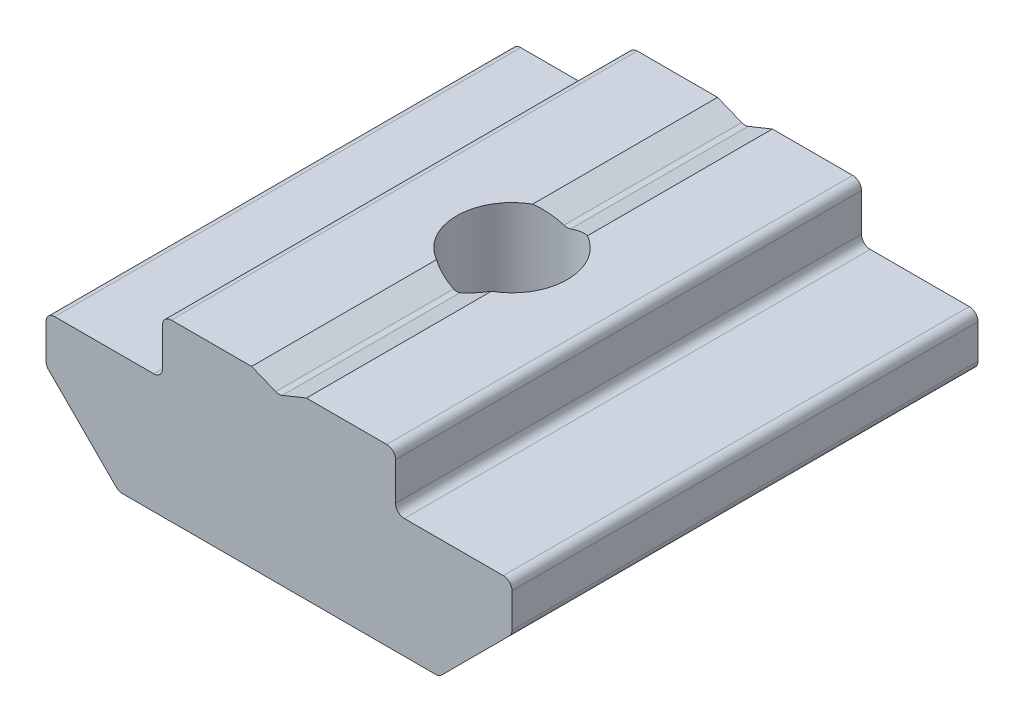
ISO-10303-21;
HEADER;
FILE_DESCRIPTION(('STEP AP214'),'2;1');
FILE_NAME('part.step','',(''),(''),'','','');
FILE_SCHEMA(('AUTOMOTIVE_DESIGN { 1 0 10303 214 1 1 1 1 }'));
ENDSEC;
DATA;
#1=APPLICATION_CONTEXT('core data for automotive mechanical design processes');
#2=APPLICATION_PROTOCOL_DEFINITION('international standard','automotive_design',2000,#1);
#3=PRODUCT_CONTEXT('',#1,'mechanical');
#4=PRODUCT('Part','Part','',(#3));
#5=PRODUCT_RELATED_PRODUCT_CATEGORY('part','',(#4));
#6=PRODUCT_DEFINITION_FORMATION('','',#4);
#7=PRODUCT_DEFINITION_CONTEXT('part definition',#1,'design');
#8=PRODUCT_DEFINITION('design','',#6,#7);
#9=PRODUCT_DEFINITION_SHAPE('','',#8);
#10=(LENGTH_UNIT() NAMED_UNIT(*) SI_UNIT(.MILLI.,.METRE.));
#11=(NAMED_UNIT(*) PLANE_ANGLE_UNIT() SI_UNIT($,.RADIAN.));
#12=(NAMED_UNIT(*) SI_UNIT($,.STERADIAN.) SOLID_ANGLE_UNIT());
#13=UNCERTAINTY_MEASURE_WITH_UNIT(LENGTH_MEASURE(1.E-05),#10,'distance_accuracy_value','');
#14=(GEOMETRIC_REPRESENTATION_CONTEXT(3) GLOBAL_UNCERTAINTY_ASSIGNED_CONTEXT((#13)) GLOBAL_UNIT_ASSIGNED_CONTEXT((#10,
#11,#12)) REPRESENTATION_CONTEXT('',''));
#15=CARTESIAN_POINT('',(0.,0.,0.));
#16=DIRECTION('',(0.,0.,1.));
#17=DIRECTION('',(1.,0.,0.));
#18=AXIS2_PLACEMENT_3D('',#15,#16,#17);
#19=CARTESIAN_POINT('',(0.940533004298188,6.,8.));
#20=DIRECTION('',(0.374606593415912,-0.927183854566787,0.));
#21=DIRECTION('',(0.927183854566787,0.374606593415912,0.));
#22=AXIS2_PLACEMENT_3D('',#19,#20,#21);
#23=PLANE('',#22);
#24=CARTESIAN_POINT('',(0.,5.62,0.));
#25=DIRECTION('',(0.374606593415912,-0.927183854566787,0.));
#26=DIRECTION('',(-0.927183854566787,-0.374606593415912,0.));
#27=AXIS2_PLACEMENT_3D('',#24,#25,#26);
#28=ELLIPSE('',#27,2.04921601108741,1.9);
#29=CARTESIAN_POINT('',(0.112381978024775,5.66540526643324,1.89667348033741));
#30=VERTEX_POINT('',#29);
#31=CARTESIAN_POINT('',(0.940533004298192,6.,1.65087784763919));
#32=VERTEX_POINT('',#31);
#33=EDGE_CURVE('E223',#30,#32,#28,.F.);
#34=ORIENTED_EDGE('',*,*,#33,.F.);
#35=DIRECTION('',(0.,0.,-1.));
#36=VECTOR('',#35,1.);
#37=CARTESIAN_POINT('',(0.112381978024774,5.66540526643324,8.));
#38=LINE('',#37,#36);
#39=CARTESIAN_POINT('',(0.112381978024774,5.66540526643324,8.));
#40=VERTEX_POINT('',#39);
#41=EDGE_CURVE('E268',#30,#40,#38,.F.);
#42=ORIENTED_EDGE('',*,*,#41,.T.);
#43=DIRECTION('',(-0.927183854566787,-0.374606593415912,0.));
#44=VECTOR('',#43,1.);
#45=CARTESIAN_POINT('',(0.940533004298188,6.,8.));
#46=LINE('',#45,#44);
#47=CARTESIAN_POINT('',(0.940533004298188,6.,8.));
#48=VERTEX_POINT('',#47);
#49=EDGE_CURVE('E254',#48,#40,#46,.T.);
#50=ORIENTED_EDGE('',*,*,#49,.F.);
#51=DIRECTION('',(0.,0.,-1.));
#52=VECTOR('',#51,1.);
#53=CARTESIAN_POINT('',(0.940533004298188,6.,8.));
#54=LINE('',#53,#52);
#55=EDGE_CURVE('E245',#48,#32,#54,.T.);
#56=ORIENTED_EDGE('',*,*,#55,.T.);
#57=EDGE_LOOP('',(#34,#42,#50,#56));
#58=FACE_BOUND('',#57,.T.);
#59=ADVANCED_FACE('F37',(#58),#23,.F.);
#60=DIRECTION('',(-0.927183854566787,-0.374606593415912,0.));
#61=VECTOR('',#60,1.);
#62=CARTESIAN_POINT('',(0.940533004298188,6.,-8.));
#63=LINE('',#62,#61);
#64=CARTESIAN_POINT('',(0.940533004298188,6.,-8.));
#65=VERTEX_POINT('',#64);
#66=CARTESIAN_POINT('',(0.112381978024774,5.66540526643324,-8.));
#67=VERTEX_POINT('',#66);
#68=EDGE_CURVE('E584',#65,#67,#63,.T.);
#69=ORIENTED_EDGE('',*,*,#68,.T.);
#70=DIRECTION('',(0.,0.,-1.));
#71=VECTOR('',#70,1.);
#72=CARTESIAN_POINT('',(0.112381978024774,5.66540526643324,-1.9));
#73=LINE('',#72,#71);
#74=CARTESIAN_POINT('',(0.112381978024774,5.66540526643324,-1.89667348033741));
#75=VERTEX_POINT('',#74);
#76=EDGE_CURVE('E261',#67,#75,#73,.F.);
#77=ORIENTED_EDGE('',*,*,#76,.T.);
#78=CARTESIAN_POINT('',(0.940533004298192,6.,-1.65087784763919));
#79=VERTEX_POINT('',#78);
#80=EDGE_CURVE('E238',#79,#75,#28,.F.);
#81=ORIENTED_EDGE('',*,*,#80,.F.);
#82=EDGE_CURVE('E246',#79,#65,#54,.T.);
#83=ORIENTED_EDGE('',*,*,#82,.T.);
#84=EDGE_LOOP('',(#69,#77,#81,#83));
#85=FACE_BOUND('',#84,.T.);
#86=ADVANCED_FACE('F392',(#85),#23,.F.);
#87=CARTESIAN_POINT('',(0.,5.62,8.));
#88=DIRECTION('',(-0.374606593415913,-0.927183854566787,0.));
#89=DIRECTION('',(0.927183854566787,-0.374606593415913,0.));
#90=AXIS2_PLACEMENT_3D('',#87,#88,#89);
#91=PLANE('',#90);
#92=CARTESIAN_POINT('',(0.,5.62,0.));
#93=DIRECTION('',(-0.374606593415913,-0.927183854566787,0.));
#94=DIRECTION('',(0.927183854566787,-0.374606593415913,0.));
#95=AXIS2_PLACEMENT_3D('',#92,#93,#94);
#96=ELLIPSE('',#95,2.04921601108741,1.9);
#97=CARTESIAN_POINT('',(-0.112381978024775,5.66540526643324,-1.89667348033741));
#98=VERTEX_POINT('',#97);
#99=CARTESIAN_POINT('',(-0.940533004298189,6.,-1.6508778476392));
#100=VERTEX_POINT('',#99);
#101=EDGE_CURVE('E239',#98,#100,#96,.F.);
#102=ORIENTED_EDGE('',*,*,#101,.F.);
#103=DIRECTION('',(0.,0.,-1.));
#104=VECTOR('',#103,1.);
#105=CARTESIAN_POINT('',(-0.112381978024774,5.66540526643324,-8.));
#106=LINE('',#105,#104);
#107=CARTESIAN_POINT('',(-0.112381978024774,5.66540526643324,-8.));
#108=VERTEX_POINT('',#107);
#109=EDGE_CURVE('E251',#98,#108,#106,.T.);
#110=ORIENTED_EDGE('',*,*,#109,.T.);
#111=DIRECTION('',(-0.927183854566787,0.374606593415913,0.));
#112=VECTOR('',#111,1.);
#113=CARTESIAN_POINT('',(0.,5.62,-8.));
#114=LINE('',#113,#112);
#115=CARTESIAN_POINT('',(-0.940533004298189,6.,-8.));
#116=VERTEX_POINT('',#115);
#117=EDGE_CURVE('E548',#108,#116,#114,.T.);
#118=ORIENTED_EDGE('',*,*,#117,.T.);
#119=DIRECTION('',(0.,0.,-1.));
#120=VECTOR('',#119,1.);
#121=CARTESIAN_POINT('',(-0.940533004298189,6.,8.));
#122=LINE('',#121,#120);
#123=EDGE_CURVE('E533',#100,#116,#122,.T.);
#124=ORIENTED_EDGE('',*,*,#123,.F.);
#125=EDGE_LOOP('',(#102,#110,#118,#124));
#126=FACE_BOUND('',#125,.T.);
#127=ADVANCED_FACE('F390',(#126),#91,.F.);
#128=DIRECTION('',(-0.927183854566787,0.374606593415913,0.));
#129=VECTOR('',#128,1.);
#130=CARTESIAN_POINT('',(0.,5.62,8.));
#131=LINE('',#130,#129);
#132=CARTESIAN_POINT('',(-0.112381978024774,5.66540526643324,8.));
#133=VERTEX_POINT('',#132);
#134=CARTESIAN_POINT('',(-0.940533004298189,6.,8.));
#135=VERTEX_POINT('',#134);
#136=EDGE_CURVE('E454',#133,#135,#131,.T.);
#137=ORIENTED_EDGE('',*,*,#136,.F.);
#138=DIRECTION('',(0.,0.,-1.));
#139=VECTOR('',#138,1.);
#140=CARTESIAN_POINT('',(-0.112381978024774,5.66540526643324,1.9));
#141=LINE('',#140,#139);
#142=CARTESIAN_POINT('',(-0.112381978024774,5.66540526643324,1.89667348033741));
#143=VERTEX_POINT('',#142);
#144=EDGE_CURVE('E262',#133,#143,#141,.T.);
#145=ORIENTED_EDGE('',*,*,#144,.T.);
#146=CARTESIAN_POINT('',(-0.940533004298189,6.,1.6508778476392));
#147=VERTEX_POINT('',#146);
#148=EDGE_CURVE('E236',#147,#143,#96,.F.);
#149=ORIENTED_EDGE('',*,*,#148,.F.);
#150=EDGE_CURVE('E257',#135,#147,#122,.T.);
#151=ORIENTED_EDGE('',*,*,#150,.F.);
#152=EDGE_LOOP('',(#137,#145,#149,#151));
#153=FACE_BOUND('',#152,.T.);
#154=ADVANCED_FACE('F391',(#153),#91,.F.);
#155=CARTESIAN_POINT('',(-4.,4.1,8.));
#156=DIRECTION('',(0.,-1.,0.));
#157=DIRECTION('',(0.,0.,-1.));
#158=AXIS2_PLACEMENT_3D('',#155,#156,#157);
#159=PLANE('',#158);
#160=DIRECTION('',(-1.,0.,0.));
#161=VECTOR('',#160,1.);
#162=CARTESIAN_POINT('',(-4.,4.1,8.));
#163=LINE('',#162,#161);
#164=CARTESIAN_POINT('',(-4.3,4.1,8.));
#165=VERTEX_POINT('',#164);
#166=CARTESIAN_POINT('',(-7.7,4.1,8.));
#167=VERTEX_POINT('',#166);
#168=EDGE_CURVE('E431',#165,#167,#163,.T.);
#169=ORIENTED_EDGE('',*,*,#168,.F.);
#170=DIRECTION('',(0.,0.,-1.));
#171=VECTOR('',#170,1.);
#172=CARTESIAN_POINT('',(-4.3,4.1,-8.));
#173=LINE('',#172,#171);
#174=CARTESIAN_POINT('',(-4.3,4.1,-8.));
#175=VERTEX_POINT('',#174);
#176=EDGE_CURVE('E325',#165,#175,#173,.T.);
#177=ORIENTED_EDGE('',*,*,#176,.T.);
#178=DIRECTION('',(-1.,0.,0.));
#179=VECTOR('',#178,1.);
#180=CARTESIAN_POINT('',(-4.,4.1,-8.));
#181=LINE('',#180,#179);
#182=CARTESIAN_POINT('',(-7.7,4.1,-8.));
#183=VERTEX_POINT('',#182);
#184=EDGE_CURVE('E591',#175,#183,#181,.T.);
#185=ORIENTED_EDGE('',*,*,#184,.T.);
#186=DIRECTION('',(0.,0.,-1.));
#187=VECTOR('',#186,1.);
#188=CARTESIAN_POINT('',(-7.7,4.1,8.));
#189=LINE('',#188,#187);
#190=EDGE_CURVE('E320',#183,#167,#189,.F.);
#191=ORIENTED_EDGE('',*,*,#190,.T.);
#192=EDGE_LOOP('',(#169,#177,#185,#191));
#193=FACE_BOUND('',#192,.T.);
#194=ADVANCED_FACE('F422',(#193),#159,.F.);
#195=CARTESIAN_POINT('',(-8.,4.1,8.));
#196=DIRECTION('',(1.,0.,0.));
#197=DIRECTION('',(0.,0.,-1.));
#198=AXIS2_PLACEMENT_3D('',#195,#196,#197);
#199=PLANE('',#198);
#200=DIRECTION('',(0.,-1.,0.));
#201=VECTOR('',#200,1.);
#202=CARTESIAN_POINT('',(-8.,4.1,8.));
#203=LINE('',#202,#201);
#204=CARTESIAN_POINT('',(-8.,3.8,8.));
#205=VERTEX_POINT('',#204);
#206=CARTESIAN_POINT('',(-8.,2.62426406871193,8.));
#207=VERTEX_POINT('',#206);
#208=EDGE_CURVE('E437',#205,#207,#203,.T.);
#209=ORIENTED_EDGE('',*,*,#208,.F.);
#210=DIRECTION('',(0.,0.,-1.));
#211=VECTOR('',#210,1.);
#212=CARTESIAN_POINT('',(-8.,3.8,8.));
#213=LINE('',#212,#211);
#214=CARTESIAN_POINT('',(-8.,3.8,-8.));
#215=VERTEX_POINT('',#214);
#216=EDGE_CURVE('E329',#205,#215,#213,.T.);
#217=ORIENTED_EDGE('',*,*,#216,.T.);
#218=DIRECTION('',(0.,-1.,0.));
#219=VECTOR('',#218,1.);
#220=CARTESIAN_POINT('',(-8.,4.1,-8.));
#221=LINE('',#220,#219);
#222=CARTESIAN_POINT('',(-8.,2.62426406871193,-8.));
#223=VERTEX_POINT('',#222);
#224=EDGE_CURVE('E600',#215,#223,#221,.T.);
#225=ORIENTED_EDGE('',*,*,#224,.T.);
#226=DIRECTION('',(0.,0.,-1.));
#227=VECTOR('',#226,1.);
#228=CARTESIAN_POINT('',(-8.,2.62426406871193,8.));
#229=LINE('',#228,#227);
#230=EDGE_CURVE('E322',#223,#207,#229,.F.);
#231=ORIENTED_EDGE('',*,*,#230,.T.);
#232=EDGE_LOOP('',(#209,#217,#225,#231));
#233=FACE_BOUND('',#232,.T.);
#234=ADVANCED_FACE('F421',(#233),#199,.F.);
#235=CARTESIAN_POINT('',(-8.,2.5,8.));
#236=DIRECTION('',(0.707106781186549,0.707106781186546,0.));
#237=DIRECTION('',(-0.707106781186546,0.707106781186549,0.));
#238=AXIS2_PLACEMENT_3D('',#235,#236,#237);
#239=PLANE('',#238);
#240=DIRECTION('',(0.707106781186546,-0.707106781186549,0.));
#241=VECTOR('',#240,1.);
#242=CARTESIAN_POINT('',(-8.,2.5,8.));
#243=LINE('',#242,#241);
#244=CARTESIAN_POINT('',(-7.91213203435596,2.41213203435596,8.));
#245=VERTEX_POINT('',#244);
#246=CARTESIAN_POINT('',(-5.58786796564405,0.0878679656440362,8.));
#247=VERTEX_POINT('',#246);
#248=EDGE_CURVE('E554',#245,#247,#243,.T.);
#249=ORIENTED_EDGE('',*,*,#248,.F.);
#250=DIRECTION('',(0.,0.,-1.));
#251=VECTOR('',#250,1.);
#252=CARTESIAN_POINT('',(-7.91213203435596,2.41213203435596,8.));
#253=LINE('',#252,#251);
#254=CARTESIAN_POINT('',(-7.91213203435596,2.41213203435596,-8.));
#255=VERTEX_POINT('',#254);
#256=EDGE_CURVE('E332',#245,#255,#253,.T.);
#257=ORIENTED_EDGE('',*,*,#256,.T.);
#258=DIRECTION('',(0.707106781186546,-0.707106781186549,0.));
#259=VECTOR('',#258,1.);
#260=CARTESIAN_POINT('',(-8.,2.5,-8.));
#261=LINE('',#260,#259);
#262=CARTESIAN_POINT('',(-5.58786796564405,0.0878679656440362,-8.));
#263=VERTEX_POINT('',#262);
#264=EDGE_CURVE('E575',#255,#263,#261,.T.);
#265=ORIENTED_EDGE('',*,*,#264,.T.);
#266=DIRECTION('',(0.,0.,-1.));
#267=VECTOR('',#266,1.);
#268=CARTESIAN_POINT('',(-5.58786796564405,0.0878679656440362,8.));
#269=LINE('',#268,#267);
#270=EDGE_CURVE('E326',#263,#247,#269,.F.);
#271=ORIENTED_EDGE('',*,*,#270,.T.);
#272=EDGE_LOOP('',(#249,#257,#265,#271));
#273=FACE_BOUND('',#272,.T.);
#274=ADVANCED_FACE('F420',(#273),#239,.F.);
#275=CARTESIAN_POINT('',(-5.50000000000001,0.,8.));
#276=DIRECTION('',(0.,1.,0.));
#277=DIRECTION('',(-1.,0.,0.));
#278=AXIS2_PLACEMENT_3D('',#275,#276,#277);
#279=PLANE('',#278);
#280=CARTESIAN_POINT('',(0.,0.,0.));
#281=DIRECTION('',(0.,1.,0.));
#282=DIRECTION('',(0.,0.,1.));
#283=AXIS2_PLACEMENT_3D('',#280,#281,#282);
#284=CIRCLE('',#283,1.9);
#285=CARTESIAN_POINT('',(0.,0.,1.9));
#286=VERTEX_POINT('',#285);
#287=EDGE_CURVE('E249',#286,#286,#284,.T.);
#288=ORIENTED_EDGE('',*,*,#287,.T.);
#289=EDGE_LOOP('',(#288));
#290=FACE_BOUND('',#289,.T.);
#291=DIRECTION('',(1.,0.,0.));
#292=VECTOR('',#291,1.);
#293=CARTESIAN_POINT('',(-5.50000000000001,0.,8.));
#294=LINE('',#293,#292);
#295=CARTESIAN_POINT('',(-5.37573593128808,0.,8.));
#296=VERTEX_POINT('',#295);
#297=CARTESIAN_POINT('',(5.37573593128808,0.,8.));
#298=VERTEX_POINT('',#297);
#299=EDGE_CURVE('E526',#296,#298,#294,.T.);
#300=ORIENTED_EDGE('',*,*,#299,.F.);
#301=DIRECTION('',(0.,0.,-1.));
#302=VECTOR('',#301,1.);
#303=CARTESIAN_POINT('',(-5.37573593128808,0.,8.));
#304=LINE('',#303,#302);
#305=CARTESIAN_POINT('',(-5.37573593128808,0.,-8.));
#306=VERTEX_POINT('',#305);
#307=EDGE_CURVE('E340',#296,#306,#304,.T.);
#308=ORIENTED_EDGE('',*,*,#307,.T.);
#309=DIRECTION('',(1.,0.,0.));
#310=VECTOR('',#309,1.);
#311=CARTESIAN_POINT('',(-5.50000000000001,0.,-8.));
#312=LINE('',#311,#310);
#313=CARTESIAN_POINT('',(5.37573593128808,0.,-8.));
#314=VERTEX_POINT('',#313);
#315=EDGE_CURVE('E568',#306,#314,#312,.T.);
#316=ORIENTED_EDGE('',*,*,#315,.T.);
#317=DIRECTION('',(0.,0.,-1.));
#318=VECTOR('',#317,1.);
#319=CARTESIAN_POINT('',(5.37573593128808,0.,8.));
#320=LINE('',#319,#318);
#321=EDGE_CURVE('E334',#314,#298,#320,.F.);
#322=ORIENTED_EDGE('',*,*,#321,.T.);
#323=EDGE_LOOP('',(#300,#308,#316,#322));
#324=FACE_BOUND('',#323,.T.);
#325=ADVANCED_FACE('F411',(#290,#324),#279,.F.);
#326=CARTESIAN_POINT('',(8.,2.49999999999998,8.));
#327=DIRECTION('',(-0.707106781186546,0.707106781186549,0.));
#328=DIRECTION('',(-0.707106781186549,-0.707106781186546,0.));
#329=AXIS2_PLACEMENT_3D('',#326,#327,#328);
#330=PLANE('',#329);
#331=DIRECTION('',(0.707106781186549,0.707106781186546,0.));
#332=VECTOR('',#331,1.);
#333=CARTESIAN_POINT('',(8.,2.49999999999998,8.));
#334=LINE('',#333,#332);
#335=CARTESIAN_POINT('',(5.58786796564405,0.0878679656440362,8.));
#336=VERTEX_POINT('',#335);
#337=CARTESIAN_POINT('',(7.91213203435596,2.41213203435594,8.));
#338=VERTEX_POINT('',#337);
#339=EDGE_CURVE('E520',#336,#338,#334,.T.);
#340=ORIENTED_EDGE('',*,*,#339,.F.);
#341=DIRECTION('',(0.,0.,-1.));
#342=VECTOR('',#341,1.);
#343=CARTESIAN_POINT('',(5.58786796564405,0.0878679656440349,8.));
#344=LINE('',#343,#342);
#345=CARTESIAN_POINT('',(5.58786796564405,0.0878679656440362,-8.));
#346=VERTEX_POINT('',#345);
#347=EDGE_CURVE('E345',#336,#346,#344,.T.);
#348=ORIENTED_EDGE('',*,*,#347,.T.);
#349=DIRECTION('',(0.707106781186549,0.707106781186546,0.));
#350=VECTOR('',#349,1.);
#351=CARTESIAN_POINT('',(8.,2.49999999999998,-8.));
#352=LINE('',#351,#350);
#353=CARTESIAN_POINT('',(7.91213203435596,2.41213203435594,-8.));
#354=VERTEX_POINT('',#353);
#355=EDGE_CURVE('E564',#346,#354,#352,.T.);
#356=ORIENTED_EDGE('',*,*,#355,.T.);
#357=DIRECTION('',(0.,0.,-1.));
#358=VECTOR('',#357,1.);
#359=CARTESIAN_POINT('',(7.91213203435596,2.41213203435594,8.));
#360=LINE('',#359,#358);
#361=EDGE_CURVE('E337',#354,#338,#360,.F.);
#362=ORIENTED_EDGE('',*,*,#361,.T.);
#363=EDGE_LOOP('',(#340,#348,#356,#362));
#364=FACE_BOUND('',#363,.T.);
#365=ADVANCED_FACE('F410',(#364),#330,.F.);
#366=CARTESIAN_POINT('',(8.,4.1,8.));
#367=DIRECTION('',(-1.,0.,0.));
#368=DIRECTION('',(0.,0.,1.));
#369=AXIS2_PLACEMENT_3D('',#366,#367,#368);
#370=PLANE('',#369);
#371=DIRECTION('',(0.,1.,0.));
#372=VECTOR('',#371,1.);
#373=CARTESIAN_POINT('',(8.,4.1,8.));
#374=LINE('',#373,#372);
#375=CARTESIAN_POINT('',(8.,2.62426406871191,8.));
#376=VERTEX_POINT('',#375);
#377=CARTESIAN_POINT('',(8.,3.8,8.));
#378=VERTEX_POINT('',#377);
#379=EDGE_CURVE('E513',#376,#378,#374,.T.);
#380=ORIENTED_EDGE('',*,*,#379,.F.);
#381=DIRECTION('',(0.,0.,-1.));
#382=VECTOR('',#381,1.);
#383=CARTESIAN_POINT('',(8.,2.62426406871191,8.));
#384=LINE('',#383,#382);
#385=CARTESIAN_POINT('',(8.,2.62426406871191,-8.));
#386=VERTEX_POINT('',#385);
#387=EDGE_CURVE('E350',#376,#386,#384,.T.);
#388=ORIENTED_EDGE('',*,*,#387,.T.);
#389=DIRECTION('',(0.,1.,0.));
#390=VECTOR('',#389,1.);
#391=CARTESIAN_POINT('',(8.,4.1,-8.));
#392=LINE('',#391,#390);
#393=CARTESIAN_POINT('',(8.,3.8,-8.));
#394=VERTEX_POINT('',#393);
#395=EDGE_CURVE('E570',#386,#394,#392,.T.);
#396=ORIENTED_EDGE('',*,*,#395,.T.);
#397=DIRECTION('',(0.,0.,-1.));
#398=VECTOR('',#397,1.);
#399=CARTESIAN_POINT('',(8.,3.8,8.));
#400=LINE('',#399,#398);
#401=EDGE_CURVE('E344',#394,#378,#400,.F.);
#402=ORIENTED_EDGE('',*,*,#401,.T.);
#403=EDGE_LOOP('',(#380,#388,#396,#402));
#404=FACE_BOUND('',#403,.T.);
#405=ADVANCED_FACE('F401',(#404),#370,.F.);
#406=CARTESIAN_POINT('',(8.,4.1,8.));
#407=DIRECTION('',(0.,-1.,0.));
#408=DIRECTION('',(1.,0.,0.));
#409=AXIS2_PLACEMENT_3D('',#406,#407,#408);
#410=PLANE('',#409);
#411=DIRECTION('',(-1.,0.,0.));
#412=VECTOR('',#411,1.);
#413=CARTESIAN_POINT('',(8.,4.1,-8.));
#414=LINE('',#413,#412);
#415=CARTESIAN_POINT('',(7.7,4.1,-8.));
#416=VERTEX_POINT('',#415);
#417=CARTESIAN_POINT('',(4.3,4.1,-8.));
#418=VERTEX_POINT('',#417);
#419=EDGE_CURVE('E569',#416,#418,#414,.T.);
#420=ORIENTED_EDGE('',*,*,#419,.T.);
#421=DIRECTION('',(0.,0.,-1.));
#422=VECTOR('',#421,1.);
#423=CARTESIAN_POINT('',(4.3,4.1,8.));
#424=LINE('',#423,#422);
#425=CARTESIAN_POINT('',(4.3,4.1,8.));
#426=VERTEX_POINT('',#425);
#427=EDGE_CURVE('E311',#418,#426,#424,.F.);
#428=ORIENTED_EDGE('',*,*,#427,.T.);
#429=DIRECTION('',(-1.,0.,0.));
#430=VECTOR('',#429,1.);
#431=CARTESIAN_POINT('',(8.,4.1,8.));
#432=LINE('',#431,#430);
#433=CARTESIAN_POINT('',(7.7,4.1,8.));
#434=VERTEX_POINT('',#433);
#435=EDGE_CURVE('E522',#434,#426,#432,.T.);
#436=ORIENTED_EDGE('',*,*,#435,.F.);
#437=DIRECTION('',(0.,0.,-1.));
#438=VECTOR('',#437,1.);
#439=CARTESIAN_POINT('',(7.7,4.1,8.));
#440=LINE('',#439,#438);
#441=EDGE_CURVE('E309',#434,#416,#440,.T.);
#442=ORIENTED_EDGE('',*,*,#441,.T.);
#443=EDGE_LOOP('',(#420,#428,#436,#442));
#444=FACE_BOUND('',#443,.T.);
#445=ADVANCED_FACE('F403',(#444),#410,.F.);
#446=CARTESIAN_POINT('',(4.,6.,8.));
#447=DIRECTION('',(-1.,0.,0.));
#448=DIRECTION('',(0.,0.,1.));
#449=AXIS2_PLACEMENT_3D('',#446,#447,#448);
#450=PLANE('',#449);
#451=DIRECTION('',(0.,1.,0.));
#452=VECTOR('',#451,1.);
#453=CARTESIAN_POINT('',(4.,6.,-8.));
#454=LINE('',#453,#452);
#455=CARTESIAN_POINT('',(4.,4.4,-8.));
#456=VERTEX_POINT('',#455);
#457=CARTESIAN_POINT('',(4.,5.7,-8.));
#458=VERTEX_POINT('',#457);
#459=EDGE_CURVE('E577',#456,#458,#454,.T.);
#460=ORIENTED_EDGE('',*,*,#459,.T.);
#461=DIRECTION('',(0.,0.,-1.));
#462=VECTOR('',#461,1.);
#463=CARTESIAN_POINT('',(4.,5.7,8.));
#464=LINE('',#463,#462);
#465=CARTESIAN_POINT('',(4.,5.7,8.));
#466=VERTEX_POINT('',#465);
#467=EDGE_CURVE('E295',#458,#466,#464,.F.);
#468=ORIENTED_EDGE('',*,*,#467,.T.);
#469=DIRECTION('',(0.,1.,0.));
#470=VECTOR('',#469,1.);
#471=CARTESIAN_POINT('',(4.,6.,8.));
#472=LINE('',#471,#470);
#473=CARTESIAN_POINT('',(4.,4.4,8.));
#474=VERTEX_POINT('',#473);
#475=EDGE_CURVE('E521',#474,#466,#472,.T.);
#476=ORIENTED_EDGE('',*,*,#475,.F.);
#477=DIRECTION('',(0.,0.,-1.));
#478=VECTOR('',#477,1.);
#479=CARTESIAN_POINT('',(4.,4.4,-8.));
#480=LINE('',#479,#478);
#481=EDGE_CURVE('E288',#474,#456,#480,.T.);
#482=ORIENTED_EDGE('',*,*,#481,.T.);
#483=EDGE_LOOP('',(#460,#468,#476,#482));
#484=FACE_BOUND('',#483,.T.);
#485=ADVANCED_FACE('F396',(#484),#450,.F.);
#486=CARTESIAN_POINT('',(0.940533004298188,6.,8.));
#487=DIRECTION('',(0.,-1.,0.));
#488=DIRECTION('',(1.,0.,0.));
#489=AXIS2_PLACEMENT_3D('',#486,#487,#488);
#490=PLANE('',#489);
#491=DIRECTION('',(-1.,0.,0.));
#492=VECTOR('',#491,1.);
#493=CARTESIAN_POINT('',(0.940533004298188,6.,8.));
#494=LINE('',#493,#492);
#495=CARTESIAN_POINT('',(3.7,6.,8.));
#496=VERTEX_POINT('',#495);
#497=EDGE_CURVE('E532',#496,#48,#494,.T.);
#498=ORIENTED_EDGE('',*,*,#497,.F.);
#499=DIRECTION('',(0.,0.,-1.));
#500=VECTOR('',#499,1.);
#501=CARTESIAN_POINT('',(3.7,6.,8.));
#502=LINE('',#501,#500);
#503=CARTESIAN_POINT('',(3.7,6.,-8.));
#504=VERTEX_POINT('',#503);
#505=EDGE_CURVE('E269',#496,#504,#502,.T.);
#506=ORIENTED_EDGE('',*,*,#505,.T.);
#507=DIRECTION('',(-1.,0.,0.));
#508=VECTOR('',#507,1.);
#509=CARTESIAN_POINT('',(0.940533004298188,6.,-8.));
#510=LINE('',#509,#508);
#511=EDGE_CURVE('E582',#504,#65,#510,.T.);
#512=ORIENTED_EDGE('',*,*,#511,.T.);
#513=ORIENTED_EDGE('',*,*,#82,.F.);
#514=CARTESIAN_POINT('',(0.,6.,0.));
#515=DIRECTION('',(0.,1.,0.));
#516=DIRECTION('',(0.,0.,1.));
#517=AXIS2_PLACEMENT_3D('',#514,#515,#516);
#518=CIRCLE('',#517,1.9);
#519=EDGE_CURVE('E228',#32,#79,#518,.T.);
#520=ORIENTED_EDGE('',*,*,#519,.F.);
#521=ORIENTED_EDGE('',*,*,#55,.F.);
#522=EDGE_LOOP('',(#498,#506,#512,#513,#520,#521));
#523=FACE_BOUND('',#522,.T.);
#524=ADVANCED_FACE('F243',(#523),#490,.F.);
#525=CARTESIAN_POINT('',(-4.,6.,8.));
#526=DIRECTION('',(0.,-1.,0.));
#527=DIRECTION('',(0.,0.,-1.));
#528=AXIS2_PLACEMENT_3D('',#525,#526,#527);
#529=PLANE('',#528);
#530=DIRECTION('',(-1.,0.,0.));
#531=VECTOR('',#530,1.);
#532=CARTESIAN_POINT('',(-4.,6.,-8.));
#533=LINE('',#532,#531);
#534=CARTESIAN_POINT('',(-3.7,6.,-8.));
#535=VERTEX_POINT('',#534);
#536=EDGE_CURVE('E543',#116,#535,#533,.T.);
#537=ORIENTED_EDGE('',*,*,#536,.T.);
#538=DIRECTION('',(0.,0.,-1.));
#539=VECTOR('',#538,1.);
#540=CARTESIAN_POINT('',(-3.7,6.,8.));
#541=LINE('',#540,#539);
#542=CARTESIAN_POINT('',(-3.7,6.,8.));
#543=VERTEX_POINT('',#542);
#544=EDGE_CURVE('E319',#535,#543,#541,.F.);
#545=ORIENTED_EDGE('',*,*,#544,.T.);
#546=DIRECTION('',(-1.,0.,0.));
#547=VECTOR('',#546,1.);
#548=CARTESIAN_POINT('',(-4.,6.,8.));
#549=LINE('',#548,#547);
#550=EDGE_CURVE('E461',#135,#543,#549,.T.);
#551=ORIENTED_EDGE('',*,*,#550,.F.);
#552=ORIENTED_EDGE('',*,*,#150,.T.);
#553=CARTESIAN_POINT('',(0.,6.,0.));
#554=DIRECTION('',(0.,-1.,0.));
#555=DIRECTION('',(0.,0.,-1.));
#556=AXIS2_PLACEMENT_3D('',#553,#554,#555);
#557=CIRCLE('',#556,1.9);
#558=EDGE_CURVE('E252',#100,#147,#557,.F.);
#559=ORIENTED_EDGE('',*,*,#558,.F.);
#560=ORIENTED_EDGE('',*,*,#123,.T.);
#561=EDGE_LOOP('',(#537,#545,#551,#552,#559,#560));
#562=FACE_BOUND('',#561,.T.);
#563=ADVANCED_FACE('F384',(#562),#529,.F.);
#564=CARTESIAN_POINT('',(-4.,4.1,8.));
#565=DIRECTION('',(1.,0.,0.));
#566=DIRECTION('',(0.,0.,-1.));
#567=AXIS2_PLACEMENT_3D('',#564,#565,#566);
#568=PLANE('',#567);
#569=DIRECTION('',(0.,-1.,0.));
#570=VECTOR('',#569,1.);
#571=CARTESIAN_POINT('',(-4.,4.1,8.));
#572=LINE('',#571,#570);
#573=CARTESIAN_POINT('',(-4.,5.7,8.));
#574=VERTEX_POINT('',#573);
#575=CARTESIAN_POINT('',(-4.,4.4,8.));
#576=VERTEX_POINT('',#575);
#577=EDGE_CURVE('E534',#574,#576,#572,.T.);
#578=ORIENTED_EDGE('',*,*,#577,.F.);
#579=DIRECTION('',(0.,0.,-1.));
#580=VECTOR('',#579,1.);
#581=CARTESIAN_POINT('',(-4.,5.7,8.));
#582=LINE('',#581,#580);
#583=CARTESIAN_POINT('',(-4.,5.7,-8.));
#584=VERTEX_POINT('',#583);
#585=EDGE_CURVE('E312',#574,#584,#582,.T.);
#586=ORIENTED_EDGE('',*,*,#585,.T.);
#587=DIRECTION('',(0.,-1.,0.));
#588=VECTOR('',#587,1.);
#589=CARTESIAN_POINT('',(-4.,4.1,-8.));
#590=LINE('',#589,#588);
#591=CARTESIAN_POINT('',(-4.,4.4,-8.));
#592=VERTEX_POINT('',#591);
#593=EDGE_CURVE('E443',#584,#592,#590,.T.);
#594=ORIENTED_EDGE('',*,*,#593,.T.);
#595=DIRECTION('',(0.,0.,-1.));
#596=VECTOR('',#595,1.);
#597=CARTESIAN_POINT('',(-4.,4.4,8.));
#598=LINE('',#597,#596);
#599=EDGE_CURVE('E54',#592,#576,#598,.F.);
#600=ORIENTED_EDGE('',*,*,#599,.T.);
#601=EDGE_LOOP('',(#578,#586,#594,#600));
#602=FACE_BOUND('',#601,.T.);
#603=ADVANCED_FACE('F382',(#602),#568,.F.);
#604=CARTESIAN_POINT('',(0.,0.,8.));
#605=DIRECTION('',(0.,0.,1.));
#606=DIRECTION('',(1.,0.,0.));
#607=AXIS2_PLACEMENT_3D('',#604,#605,#606);
#608=PLANE('',#607);
#609=ORIENTED_EDGE('',*,*,#475,.T.);
#610=CARTESIAN_POINT('',(3.7,5.7,8.));
#611=DIRECTION('',(0.,0.,1.));
#612=DIRECTION('',(1.,0.,0.));
#613=AXIS2_PLACEMENT_3D('',#610,#611,#612);
#614=CIRCLE('',#613,0.3);
#615=EDGE_CURVE('E310',#466,#496,#614,.T.);
#616=ORIENTED_EDGE('',*,*,#615,.T.);
#617=ORIENTED_EDGE('',*,*,#497,.T.);
#618=ORIENTED_EDGE('',*,*,#49,.T.);
#619=CARTESIAN_POINT('',(0.,5.94356042280328,8.));
#620=DIRECTION('',(0.,0.,1.));
#621=DIRECTION('',(1.,0.,0.));
#622=AXIS2_PLACEMENT_3D('',#619,#620,#621);
#623=CIRCLE('',#622,0.3);
#624=EDGE_CURVE('E451',#40,#133,#623,.F.);
#625=ORIENTED_EDGE('',*,*,#624,.T.);
#626=ORIENTED_EDGE('',*,*,#136,.T.);
#627=ORIENTED_EDGE('',*,*,#550,.T.);
#628=CARTESIAN_POINT('',(-3.7,5.7,8.));
#629=DIRECTION('',(0.,0.,1.));
#630=DIRECTION('',(1.,0.,0.));
#631=AXIS2_PLACEMENT_3D('',#628,#629,#630);
#632=CIRCLE('',#631,0.3);
#633=EDGE_CURVE('E61',#543,#574,#632,.T.);
#634=ORIENTED_EDGE('',*,*,#633,.T.);
#635=ORIENTED_EDGE('',*,*,#577,.T.);
#636=CARTESIAN_POINT('',(-4.3,4.4,8.));
#637=DIRECTION('',(0.,0.,1.));
#638=DIRECTION('',(1.,0.,0.));
#639=AXIS2_PLACEMENT_3D('',#636,#637,#638);
#640=CIRCLE('',#639,0.3);
#641=EDGE_CURVE('E11',#576,#165,#640,.F.);
#642=ORIENTED_EDGE('',*,*,#641,.T.);
#643=ORIENTED_EDGE('',*,*,#168,.T.);
#644=CARTESIAN_POINT('',(-7.7,3.8,8.));
#645=DIRECTION('',(0.,0.,1.));
#646=DIRECTION('',(1.,0.,0.));
#647=AXIS2_PLACEMENT_3D('',#644,#645,#646);
#648=CIRCLE('',#647,0.3);
#649=EDGE_CURVE('E303',#167,#205,#648,.T.);
#650=ORIENTED_EDGE('',*,*,#649,.T.);
#651=ORIENTED_EDGE('',*,*,#208,.T.);
#652=CARTESIAN_POINT('',(-7.7,2.62426406871193,8.));
#653=DIRECTION('',(0.,0.,1.));
#654=DIRECTION('',(1.,0.,0.));
#655=AXIS2_PLACEMENT_3D('',#652,#653,#654);
#656=CIRCLE('',#655,0.3);
#657=EDGE_CURVE('E305',#207,#245,#656,.T.);
#658=ORIENTED_EDGE('',*,*,#657,.T.);
#659=ORIENTED_EDGE('',*,*,#248,.T.);
#660=CARTESIAN_POINT('',(-5.37573593128808,0.3,8.));
#661=DIRECTION('',(0.,0.,1.));
#662=DIRECTION('',(1.,0.,0.));
#663=AXIS2_PLACEMENT_3D('',#660,#661,#662);
#664=CIRCLE('',#663,0.3);
#665=EDGE_CURVE('E298',#247,#296,#664,.T.);
#666=ORIENTED_EDGE('',*,*,#665,.T.);
#667=ORIENTED_EDGE('',*,*,#299,.T.);
#668=CARTESIAN_POINT('',(5.37573593128808,0.3,8.));
#669=DIRECTION('',(0.,0.,1.));
#670=DIRECTION('',(1.,0.,0.));
#671=AXIS2_PLACEMENT_3D('',#668,#669,#670);
#672=CIRCLE('',#671,0.3);
#673=EDGE_CURVE('E299',#298,#336,#672,.T.);
#674=ORIENTED_EDGE('',*,*,#673,.T.);
#675=ORIENTED_EDGE('',*,*,#339,.T.);
#676=CARTESIAN_POINT('',(7.7,2.62426406871191,8.));
#677=DIRECTION('',(0.,0.,1.));
#678=DIRECTION('',(1.,0.,0.));
#679=AXIS2_PLACEMENT_3D('',#676,#677,#678);
#680=CIRCLE('',#679,0.3);
#681=EDGE_CURVE('E297',#338,#376,#680,.T.);
#682=ORIENTED_EDGE('',*,*,#681,.T.);
#683=ORIENTED_EDGE('',*,*,#379,.T.);
#684=CARTESIAN_POINT('',(7.7,3.8,8.));
#685=DIRECTION('',(0.,0.,1.));
#686=DIRECTION('',(1.,0.,0.));
#687=AXIS2_PLACEMENT_3D('',#684,#685,#686);
#688=CIRCLE('',#687,0.3);
#689=EDGE_CURVE('E294',#378,#434,#688,.T.);
#690=ORIENTED_EDGE('',*,*,#689,.T.);
#691=ORIENTED_EDGE('',*,*,#435,.T.);
#692=CARTESIAN_POINT('',(4.3,4.4,8.));
#693=DIRECTION('',(0.,0.,1.));
#694=DIRECTION('',(1.,0.,0.));
#695=AXIS2_PLACEMENT_3D('',#692,#693,#694);
#696=CIRCLE('',#695,0.3);
#697=EDGE_CURVE('E450',#426,#474,#696,.F.);
#698=ORIENTED_EDGE('',*,*,#697,.T.);
#699=EDGE_LOOP('',(#609,#616,#617,#618,#625,#626,#627,#634,#635,#642,#643,#650,#651,#658,#659,
#666,#667,#674,#675,#682,#683,#690,#691,#698));
#700=FACE_BOUND('',#699,.T.);
#701=ADVANCED_FACE('F380',(#700),#608,.T.);
#702=CARTESIAN_POINT('',(0.,0.,-8.));
#703=DIRECTION('',(0.,0.,1.));
#704=DIRECTION('',(1.,0.,0.));
#705=AXIS2_PLACEMENT_3D('',#702,#703,#704);
#706=PLANE('',#705);
#707=ORIENTED_EDGE('',*,*,#511,.F.);
#708=CARTESIAN_POINT('',(3.7,5.7,-8.));
#709=DIRECTION('',(0.,0.,1.));
#710=DIRECTION('',(1.,0.,0.));
#711=AXIS2_PLACEMENT_3D('',#708,#709,#710);
#712=CIRCLE('',#711,0.3);
#713=EDGE_CURVE('E286',#504,#458,#712,.F.);
#714=ORIENTED_EDGE('',*,*,#713,.T.);
#715=ORIENTED_EDGE('',*,*,#459,.F.);
#716=CARTESIAN_POINT('',(4.3,4.4,-8.));
#717=DIRECTION('',(0.,0.,1.));
#718=DIRECTION('',(1.,0.,0.));
#719=AXIS2_PLACEMENT_3D('',#716,#717,#718);
#720=CIRCLE('',#719,0.3);
#721=EDGE_CURVE('E449',#456,#418,#720,.T.);
#722=ORIENTED_EDGE('',*,*,#721,.T.);
#723=ORIENTED_EDGE('',*,*,#419,.F.);
#724=CARTESIAN_POINT('',(7.7,3.8,-8.));
#725=DIRECTION('',(0.,0.,1.));
#726=DIRECTION('',(1.,0.,0.));
#727=AXIS2_PLACEMENT_3D('',#724,#725,#726);
#728=CIRCLE('',#727,0.3);
#729=EDGE_CURVE('E273',#416,#394,#728,.F.);
#730=ORIENTED_EDGE('',*,*,#729,.T.);
#731=ORIENTED_EDGE('',*,*,#395,.F.);
#732=CARTESIAN_POINT('',(7.7,2.62426406871191,-8.));
#733=DIRECTION('',(0.,0.,1.));
#734=DIRECTION('',(1.,0.,0.));
#735=AXIS2_PLACEMENT_3D('',#732,#733,#734);
#736=CIRCLE('',#735,0.3);
#737=EDGE_CURVE('E274',#386,#354,#736,.F.);
#738=ORIENTED_EDGE('',*,*,#737,.T.);
#739=ORIENTED_EDGE('',*,*,#355,.F.);
#740=CARTESIAN_POINT('',(5.37573593128808,0.3,-8.));
#741=DIRECTION('',(0.,0.,1.));
#742=DIRECTION('',(1.,0.,0.));
#743=AXIS2_PLACEMENT_3D('',#740,#741,#742);
#744=CIRCLE('',#743,0.3);
#745=EDGE_CURVE('E280',#346,#314,#744,.F.);
#746=ORIENTED_EDGE('',*,*,#745,.T.);
#747=ORIENTED_EDGE('',*,*,#315,.F.);
#748=CARTESIAN_POINT('',(-5.37573593128808,0.3,-8.));
#749=DIRECTION('',(0.,0.,1.));
#750=DIRECTION('',(1.,0.,0.));
#751=AXIS2_PLACEMENT_3D('',#748,#749,#750);
#752=CIRCLE('',#751,0.3);
#753=EDGE_CURVE('E278',#306,#263,#752,.F.);
#754=ORIENTED_EDGE('',*,*,#753,.T.);
#755=ORIENTED_EDGE('',*,*,#264,.F.);
#756=CARTESIAN_POINT('',(-7.7,2.62426406871193,-8.));
#757=DIRECTION('',(0.,0.,1.));
#758=DIRECTION('',(1.,0.,0.));
#759=AXIS2_PLACEMENT_3D('',#756,#757,#758);
#760=CIRCLE('',#759,0.3);
#761=EDGE_CURVE('E282',#255,#223,#760,.F.);
#762=ORIENTED_EDGE('',*,*,#761,.T.);
#763=ORIENTED_EDGE('',*,*,#224,.F.);
#764=CARTESIAN_POINT('',(-7.7,3.8,-8.));
#765=DIRECTION('',(0.,0.,1.));
#766=DIRECTION('',(1.,0.,0.));
#767=AXIS2_PLACEMENT_3D('',#764,#765,#766);
#768=CIRCLE('',#767,0.3);
#769=EDGE_CURVE('E284',#215,#183,#768,.F.);
#770=ORIENTED_EDGE('',*,*,#769,.T.);
#771=ORIENTED_EDGE('',*,*,#184,.F.);
#772=CARTESIAN_POINT('',(-4.3,4.4,-8.));
#773=DIRECTION('',(0.,0.,1.));
#774=DIRECTION('',(1.,0.,0.));
#775=AXIS2_PLACEMENT_3D('',#772,#773,#774);
#776=CIRCLE('',#775,0.3);
#777=EDGE_CURVE('E48',#175,#592,#776,.T.);
#778=ORIENTED_EDGE('',*,*,#777,.T.);
#779=ORIENTED_EDGE('',*,*,#593,.F.);
#780=CARTESIAN_POINT('',(-3.7,5.7,-8.));
#781=DIRECTION('',(0.,0.,1.));
#782=DIRECTION('',(1.,0.,0.));
#783=AXIS2_PLACEMENT_3D('',#780,#781,#782);
#784=CIRCLE('',#783,0.3);
#785=EDGE_CURVE('E283',#584,#535,#784,.F.);
#786=ORIENTED_EDGE('',*,*,#785,.T.);
#787=ORIENTED_EDGE('',*,*,#536,.F.);
#788=ORIENTED_EDGE('',*,*,#117,.F.);
#789=CARTESIAN_POINT('',(0.,5.94356042280328,-8.));
#790=DIRECTION('',(0.,0.,1.));
#791=DIRECTION('',(1.,0.,0.));
#792=AXIS2_PLACEMENT_3D('',#789,#790,#791);
#793=CIRCLE('',#792,0.3);
#794=EDGE_CURVE('E349',#108,#67,#793,.T.);
#795=ORIENTED_EDGE('',*,*,#794,.T.);
#796=ORIENTED_EDGE('',*,*,#68,.F.);
#797=EDGE_LOOP('',(#707,#714,#715,#722,#723,#730,#731,#738,#739,#746,#747,#754,#755,#762,#763,
#770,#771,#778,#779,#786,#787,#788,#795,#796));
#798=FACE_BOUND('',#797,.T.);
#799=ADVANCED_FACE('F375',(#798),#706,.F.);
#800=CARTESIAN_POINT('',(0.,6.,0.));
#801=DIRECTION('',(0.,-1.,0.));
#802=DIRECTION('',(0.,0.,-1.));
#803=AXIS2_PLACEMENT_3D('',#800,#801,#802);
#804=CYLINDRICAL_SURFACE('',#803,1.9);
#805=ORIENTED_EDGE('',*,*,#287,.F.);
#806=EDGE_LOOP('',(#805));
#807=FACE_BOUND('',#806,.T.);
#808=ORIENTED_EDGE('',*,*,#80,.T.);
#809=CARTESIAN_POINT('',(0.112381978024774,5.66540526643324,-1.89667348033741));
#810=CARTESIAN_POINT('',(0.0969285985219074,5.6591452529334,-1.8975973992089));
#811=CARTESIAN_POINT('',(0.0809362584858658,5.65419842778582,-1.89834766925824));
#812=CARTESIAN_POINT('',(0.0483289111642658,5.64701243113197,-1.8994530768944));
#813=CARTESIAN_POINT('',(0.0317134703649996,5.64477518220834,-1.89980793390123));
#814=CARTESIAN_POINT('',(-0.00167591428003668,5.64309801273533,-1.90007334711651));
#815=CARTESIAN_POINT('',(-0.0184499819936603,5.64366049618045,-1.89998352149789));
#816=CARTESIAN_POINT('',(-0.0516303063753626,5.64756710602938,-1.89937020809875));
#817=CARTESIAN_POINT('',(-0.0680372685725888,5.65090532194307,-1.89884764178183));
#818=CARTESIAN_POINT('',(-0.0936501121526005,5.65837462543157,-1.89771580722695));
#819=CARTESIAN_POINT('',(-0.103115192294923,5.6616567209536,-1.89722449938996));
#820=CARTESIAN_POINT('',(-0.112381978024774,5.66540526643324,-1.89667348033741));
#821=B_SPLINE_CURVE_WITH_KNOTS('',3,(#809,#810,#811,#812,#813,#814,#815,#816,#817,#818,#819,
#820),.UNSPECIFIED.,.F.,.F.,(4,2,2,2,2,4),(0.,0.0500340722272199,0.100103625422533,
0.150216178329617,0.200222296802184,0.230258780210499),.UNSPECIFIED.);
#822=EDGE_CURVE('E355',#75,#98,#821,.T.);
#823=ORIENTED_EDGE('',*,*,#822,.T.);
#824=ORIENTED_EDGE('',*,*,#101,.T.);
#825=ORIENTED_EDGE('',*,*,#558,.T.);
#826=ORIENTED_EDGE('',*,*,#148,.T.);
#827=CARTESIAN_POINT('',(-0.112381978024774,5.66540526643324,1.89667348033741));
#828=CARTESIAN_POINT('',(-0.0969285985219069,5.6591452529334,1.8975973992089));
#829=CARTESIAN_POINT('',(-0.0809362584858652,5.65419842778582,1.89834766925824));
#830=CARTESIAN_POINT('',(-0.0483289111642651,5.64701243113197,1.8994530768944));
#831=CARTESIAN_POINT('',(-0.0317134703649989,5.64477518220834,1.89980793390123));
#832=CARTESIAN_POINT('',(0.00167591428003755,5.64309801273533,1.90007334711651));
#833=CARTESIAN_POINT('',(0.0184499819936611,5.64366049618045,1.89998352149789));
#834=CARTESIAN_POINT('',(0.0516303063753635,5.64756710602938,1.89937020809875));
#835=CARTESIAN_POINT('',(0.0680372685725898,5.65090532194307,1.89884764178183));
#836=CARTESIAN_POINT('',(0.0936501121526014,5.65837462543157,1.89771580722695));
#837=CARTESIAN_POINT('',(0.103115192294924,5.6616567209536,1.89722449938996));
#838=CARTESIAN_POINT('',(0.112381978024774,5.66540526643324,1.89667348033741));
#839=B_SPLINE_CURVE_WITH_KNOTS('',3,(#827,#828,#829,#830,#831,#832,#833,#834,#835,#836,#837,
#838),.UNSPECIFIED.,.F.,.F.,(4,2,2,2,2,4),(0.,0.0500340722272201,0.100103625422533,
0.150216178329618,0.200222296802185,0.230258780210499),.UNSPECIFIED.);
#840=EDGE_CURVE('E235',#143,#30,#839,.T.);
#841=ORIENTED_EDGE('',*,*,#840,.T.);
#842=ORIENTED_EDGE('',*,*,#33,.T.);
#843=ORIENTED_EDGE('',*,*,#519,.T.);
#844=EDGE_LOOP('',(#808,#823,#824,#825,#826,#841,#842,#843));
#845=FACE_BOUND('',#844,.T.);
#846=ADVANCED_FACE('F227',(#807,#845),#804,.F.);
#847=CARTESIAN_POINT('',(0.,5.94356042280328,8.));
#848=DIRECTION('',(0.,0.,1.));
#849=DIRECTION('',(1.,0.,0.));
#850=AXIS2_PLACEMENT_3D('',#847,#848,#849);
#851=CYLINDRICAL_SURFACE('',#850,0.3);
#852=ORIENTED_EDGE('',*,*,#822,.F.);
#853=ORIENTED_EDGE('',*,*,#76,.F.);
#854=ORIENTED_EDGE('',*,*,#794,.F.);
#855=ORIENTED_EDGE('',*,*,#109,.F.);
#856=EDGE_LOOP('',(#852,#853,#854,#855));
#857=FACE_BOUND('',#856,.T.);
#858=ADVANCED_FACE('F368',(#857),#851,.F.);
#859=CARTESIAN_POINT('',(0.,5.94356042280328,8.));
#860=DIRECTION('',(0.,0.,1.));
#861=DIRECTION('',(1.,0.,0.));
#862=AXIS2_PLACEMENT_3D('',#859,#860,#861);
#863=CYLINDRICAL_SURFACE('',#862,0.3);
#864=ORIENTED_EDGE('',*,*,#624,.F.);
#865=ORIENTED_EDGE('',*,*,#41,.F.);
#866=ORIENTED_EDGE('',*,*,#840,.F.);
#867=ORIENTED_EDGE('',*,*,#144,.F.);
#868=EDGE_LOOP('',(#864,#865,#866,#867));
#869=FACE_BOUND('',#868,.T.);
#870=ADVANCED_FACE('F463',(#869),#863,.F.);
#871=CARTESIAN_POINT('',(3.7,5.7,8.));
#872=DIRECTION('',(0.,0.,-1.));
#873=DIRECTION('',(-1.,0.,0.));
#874=AXIS2_PLACEMENT_3D('',#871,#872,#873);
#875=CYLINDRICAL_SURFACE('',#874,0.3);
#876=ORIENTED_EDGE('',*,*,#615,.F.);
#877=ORIENTED_EDGE('',*,*,#467,.F.);
#878=ORIENTED_EDGE('',*,*,#713,.F.);
#879=ORIENTED_EDGE('',*,*,#505,.F.);
#880=EDGE_LOOP('',(#876,#877,#878,#879));
#881=FACE_BOUND('',#880,.T.);
#882=ADVANCED_FACE('F466',(#881),#875,.T.);
#883=CARTESIAN_POINT('',(4.3,4.4,8.));
#884=DIRECTION('',(0.,0.,1.));
#885=DIRECTION('',(1.,0.,0.));
#886=AXIS2_PLACEMENT_3D('',#883,#884,#885);
#887=CYLINDRICAL_SURFACE('',#886,0.3);
#888=ORIENTED_EDGE('',*,*,#697,.F.);
#889=ORIENTED_EDGE('',*,*,#427,.F.);
#890=ORIENTED_EDGE('',*,*,#721,.F.);
#891=ORIENTED_EDGE('',*,*,#481,.F.);
#892=EDGE_LOOP('',(#888,#889,#890,#891));
#893=FACE_BOUND('',#892,.T.);
#894=ADVANCED_FACE('F473',(#893),#887,.F.);
#895=CARTESIAN_POINT('',(-3.7,5.7,8.));
#896=DIRECTION('',(0.,0.,-1.));
#897=DIRECTION('',(-1.,0.,0.));
#898=AXIS2_PLACEMENT_3D('',#895,#896,#897);
#899=CYLINDRICAL_SURFACE('',#898,0.3);
#900=ORIENTED_EDGE('',*,*,#633,.F.);
#901=ORIENTED_EDGE('',*,*,#544,.F.);
#902=ORIENTED_EDGE('',*,*,#785,.F.);
#903=ORIENTED_EDGE('',*,*,#585,.F.);
#904=EDGE_LOOP('',(#900,#901,#902,#903));
#905=FACE_BOUND('',#904,.T.);
#906=ADVANCED_FACE('F480',(#905),#899,.T.);
#907=CARTESIAN_POINT('',(-4.3,4.4,8.));
#908=DIRECTION('',(0.,0.,1.));
#909=DIRECTION('',(1.,0.,0.));
#910=AXIS2_PLACEMENT_3D('',#907,#908,#909);
#911=CYLINDRICAL_SURFACE('',#910,0.3);
#912=ORIENTED_EDGE('',*,*,#641,.F.);
#913=ORIENTED_EDGE('',*,*,#599,.F.);
#914=ORIENTED_EDGE('',*,*,#777,.F.);
#915=ORIENTED_EDGE('',*,*,#176,.F.);
#916=EDGE_LOOP('',(#912,#913,#914,#915));
#917=FACE_BOUND('',#916,.T.);
#918=ADVANCED_FACE('F442',(#917),#911,.F.);
#919=CARTESIAN_POINT('',(-7.7,3.8,8.));
#920=DIRECTION('',(0.,0.,-1.));
#921=DIRECTION('',(-1.,0.,0.));
#922=AXIS2_PLACEMENT_3D('',#919,#920,#921);
#923=CYLINDRICAL_SURFACE('',#922,0.3);
#924=ORIENTED_EDGE('',*,*,#649,.F.);
#925=ORIENTED_EDGE('',*,*,#190,.F.);
#926=ORIENTED_EDGE('',*,*,#769,.F.);
#927=ORIENTED_EDGE('',*,*,#216,.F.);
#928=EDGE_LOOP('',(#924,#925,#926,#927));
#929=FACE_BOUND('',#928,.T.);
#930=ADVANCED_FACE('F488',(#929),#923,.T.);
#931=CARTESIAN_POINT('',(-7.7,2.62426406871193,8.));
#932=DIRECTION('',(0.,0.,-1.));
#933=DIRECTION('',(-1.,0.,0.));
#934=AXIS2_PLACEMENT_3D('',#931,#932,#933);
#935=CYLINDRICAL_SURFACE('',#934,0.3);
#936=ORIENTED_EDGE('',*,*,#657,.F.);
#937=ORIENTED_EDGE('',*,*,#230,.F.);
#938=ORIENTED_EDGE('',*,*,#761,.F.);
#939=ORIENTED_EDGE('',*,*,#256,.F.);
#940=EDGE_LOOP('',(#936,#937,#938,#939));
#941=FACE_BOUND('',#940,.T.);
#942=ADVANCED_FACE('F489',(#941),#935,.T.);
#943=CARTESIAN_POINT('',(-5.37573593128808,0.3,8.));
#944=DIRECTION('',(0.,0.,-1.));
#945=DIRECTION('',(-1.,0.,0.));
#946=AXIS2_PLACEMENT_3D('',#943,#944,#945);
#947=CYLINDRICAL_SURFACE('',#946,0.3);
#948=ORIENTED_EDGE('',*,*,#665,.F.);
#949=ORIENTED_EDGE('',*,*,#270,.F.);
#950=ORIENTED_EDGE('',*,*,#753,.F.);
#951=ORIENTED_EDGE('',*,*,#307,.F.);
#952=EDGE_LOOP('',(#948,#949,#950,#951));
#953=FACE_BOUND('',#952,.T.);
#954=ADVANCED_FACE('F493',(#953),#947,.T.);
#955=CARTESIAN_POINT('',(5.37573593128808,0.3,8.));
#956=DIRECTION('',(0.,0.,-1.));
#957=DIRECTION('',(-1.,0.,0.));
#958=AXIS2_PLACEMENT_3D('',#955,#956,#957);
#959=CYLINDRICAL_SURFACE('',#958,0.3);
#960=ORIENTED_EDGE('',*,*,#673,.F.);
#961=ORIENTED_EDGE('',*,*,#321,.F.);
#962=ORIENTED_EDGE('',*,*,#745,.F.);
#963=ORIENTED_EDGE('',*,*,#347,.F.);
#964=EDGE_LOOP('',(#960,#961,#962,#963));
#965=FACE_BOUND('',#964,.T.);
#966=ADVANCED_FACE('F500',(#965),#959,.T.);
#967=CARTESIAN_POINT('',(7.7,2.62426406871191,8.));
#968=DIRECTION('',(0.,0.,-1.));
#969=DIRECTION('',(-1.,0.,0.));
#970=AXIS2_PLACEMENT_3D('',#967,#968,#969);
#971=CYLINDRICAL_SURFACE('',#970,0.3);
#972=ORIENTED_EDGE('',*,*,#681,.F.);
#973=ORIENTED_EDGE('',*,*,#361,.F.);
#974=ORIENTED_EDGE('',*,*,#737,.F.);
#975=ORIENTED_EDGE('',*,*,#387,.F.);
#976=EDGE_LOOP('',(#972,#973,#974,#975));
#977=FACE_BOUND('',#976,.T.);
#978=ADVANCED_FACE('F499',(#977),#971,.T.);
#979=CARTESIAN_POINT('',(7.7,3.8,8.));
#980=DIRECTION('',(0.,0.,-1.));
#981=DIRECTION('',(-1.,0.,0.));
#982=AXIS2_PLACEMENT_3D('',#979,#980,#981);
#983=CYLINDRICAL_SURFACE('',#982,0.3);
#984=ORIENTED_EDGE('',*,*,#689,.F.);
#985=ORIENTED_EDGE('',*,*,#401,.F.);
#986=ORIENTED_EDGE('',*,*,#729,.F.);
#987=ORIENTED_EDGE('',*,*,#441,.F.);
#988=EDGE_LOOP('',(#984,#985,#986,#987));
#989=FACE_BOUND('',#988,.T.);
#990=ADVANCED_FACE('F45',(#989),#983,.T.);
#991=CLOSED_SHELL('',(#59,#86,#127,#154,#194,#234,#274,#325,#365,#405,#445,#485,#524,#563,#603,
#701,#799,#846,#858,#870,#882,#894,#906,#918,#930,#942,#954,#966,#978,#990));
#992=MANIFOLD_SOLID_BREP('B2',#991);
#993=ADVANCED_BREP_SHAPE_REPRESENTATION('',(#18,#992),#14);
#994=SHAPE_DEFINITION_REPRESENTATION(#9,#993);
ENDSEC;
END-ISO-10303-21;
